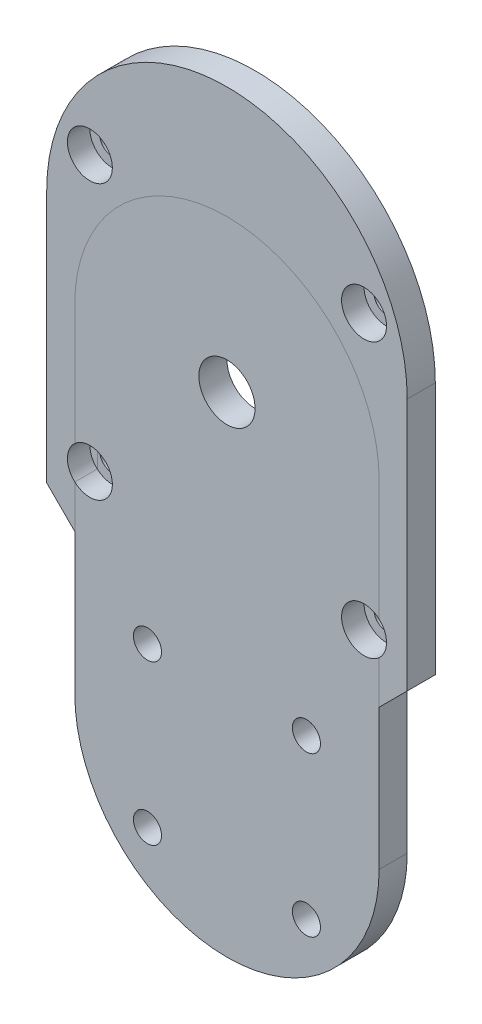
ISO-10303-21;
HEADER;
FILE_DESCRIPTION(('STEP AP214'),'2;1');
FILE_NAME('part.step','',(''),(''),'','','');
FILE_SCHEMA(('AUTOMOTIVE_DESIGN { 1 0 10303 214 1 1 1 1 }'));
ENDSEC;
DATA;
#1=APPLICATION_CONTEXT('core data for automotive mechanical design processes');
#2=APPLICATION_PROTOCOL_DEFINITION('international standard','automotive_design',2000,#1);
#3=PRODUCT_CONTEXT('',#1,'mechanical');
#4=PRODUCT('Part','Part','',(#3));
#5=PRODUCT_RELATED_PRODUCT_CATEGORY('part','',(#4));
#6=PRODUCT_DEFINITION_FORMATION('','',#4);
#7=PRODUCT_DEFINITION_CONTEXT('part definition',#1,'design');
#8=PRODUCT_DEFINITION('design','',#6,#7);
#9=PRODUCT_DEFINITION_SHAPE('','',#8);
#10=(LENGTH_UNIT() NAMED_UNIT(*) SI_UNIT(.MILLI.,.METRE.));
#11=(NAMED_UNIT(*) PLANE_ANGLE_UNIT() SI_UNIT($,.RADIAN.));
#12=(NAMED_UNIT(*) SI_UNIT($,.STERADIAN.) SOLID_ANGLE_UNIT());
#13=UNCERTAINTY_MEASURE_WITH_UNIT(LENGTH_MEASURE(1.E-05),#10,'distance_accuracy_value','');
#14=(GEOMETRIC_REPRESENTATION_CONTEXT(3) GLOBAL_UNCERTAINTY_ASSIGNED_CONTEXT((#13)) GLOBAL_UNIT_ASSIGNED_CONTEXT((#10,
#11,#12)) REPRESENTATION_CONTEXT('',''));
#15=CARTESIAN_POINT('',(0.,0.,0.));
#16=DIRECTION('',(0.,0.,1.));
#17=DIRECTION('',(1.,0.,0.));
#18=AXIS2_PLACEMENT_3D('',#15,#16,#17);
#19=CARTESIAN_POINT('',(0.,60.,5.));
#20=DIRECTION('',(0.,0.,-1.));
#21=DIRECTION('',(-1.,0.,0.));
#22=AXIS2_PLACEMENT_3D('',#19,#20,#21);
#23=PLANE('',#22);
#24=CARTESIAN_POINT('',(-24.3951839509359,84.3951839509359,5.));
#25=DIRECTION('',(0.,0.,1.));
#26=DIRECTION('',(1.,0.,0.));
#27=AXIS2_PLACEMENT_3D('',#24,#25,#26);
#28=CIRCLE('',#27,4.);
#29=CARTESIAN_POINT('',(-20.3951839509359,84.3951839509359,5.));
#30=VERTEX_POINT('',#29);
#31=EDGE_CURVE('E547',#30,#30,#28,.T.);
#32=ORIENTED_EDGE('',*,*,#31,.F.);
#33=EDGE_LOOP('',(#32));
#34=FACE_BOUND('',#33,.T.);
#35=CARTESIAN_POINT('',(24.395183950936,84.3951839509364,5.));
#36=DIRECTION('',(0.,0.,1.));
#37=DIRECTION('',(1.,0.,0.));
#38=AXIS2_PLACEMENT_3D('',#35,#36,#37);
#39=CIRCLE('',#38,4.);
#40=CARTESIAN_POINT('',(28.395183950936,84.3951839509364,5.));
#41=VERTEX_POINT('',#40);
#42=EDGE_CURVE('E173',#41,#41,#39,.T.);
#43=ORIENTED_EDGE('',*,*,#42,.F.);
#44=EDGE_LOOP('',(#43));
#45=FACE_BOUND('',#44,.T.);
#46=DIRECTION('',(0.,-1.,0.));
#47=VECTOR('',#46,1.);
#48=CARTESIAN_POINT('',(27.08,60.,5.));
#49=LINE('',#48,#47);
#50=CARTESIAN_POINT('',(27.08,60.,5.));
#51=VERTEX_POINT('',#50);
#52=CARTESIAN_POINT('',(27.08,38.5699067361583,5.));
#53=VERTEX_POINT('',#52);
#54=EDGE_CURVE('E218',#51,#53,#49,.T.);
#55=ORIENTED_EDGE('',*,*,#54,.T.);
#56=CARTESIAN_POINT('',(24.3951839509364,35.6048160490646,5.));
#57=DIRECTION('',(0.,0.,1.));
#58=DIRECTION('',(1.,0.,0.));
#59=AXIS2_PLACEMENT_3D('',#56,#57,#58);
#60=CIRCLE('',#59,4.);
#61=CARTESIAN_POINT('',(27.08,32.6397253619708,5.));
#62=VERTEX_POINT('',#61);
#63=EDGE_CURVE('E71',#62,#53,#60,.T.);
#64=ORIENTED_EDGE('',*,*,#63,.F.);
#65=CARTESIAN_POINT('',(27.08,25.,5.));
#66=VERTEX_POINT('',#65);
#67=EDGE_CURVE('E217',#62,#66,#49,.T.);
#68=ORIENTED_EDGE('',*,*,#67,.T.);
#69=DIRECTION('',(0.707106781186548,0.707106781186547,0.));
#70=VECTOR('',#69,1.);
#71=CARTESIAN_POINT('',(32.08,30.,5.));
#72=LINE('',#71,#70);
#73=CARTESIAN_POINT('',(32.08,30.,5.));
#74=VERTEX_POINT('',#73);
#75=EDGE_CURVE('E220',#66,#74,#72,.T.);
#76=ORIENTED_EDGE('',*,*,#75,.T.);
#77=DIRECTION('',(0.,1.,0.));
#78=VECTOR('',#77,1.);
#79=CARTESIAN_POINT('',(32.08,30.,5.));
#80=LINE('',#79,#78);
#81=CARTESIAN_POINT('',(32.08,75.,5.));
#82=VERTEX_POINT('',#81);
#83=EDGE_CURVE('E223',#74,#82,#80,.T.);
#84=ORIENTED_EDGE('',*,*,#83,.T.);
#85=CARTESIAN_POINT('',(0.,75.,5.));
#86=DIRECTION('',(0.,0.,1.));
#87=DIRECTION('',(-1.,0.,0.));
#88=AXIS2_PLACEMENT_3D('',#85,#86,#87);
#89=CIRCLE('',#88,32.08);
#90=CARTESIAN_POINT('',(-32.08,75.,5.));
#91=VERTEX_POINT('',#90);
#92=EDGE_CURVE('E226',#82,#91,#89,.T.);
#93=ORIENTED_EDGE('',*,*,#92,.T.);
#94=DIRECTION('',(0.,-1.,0.));
#95=VECTOR('',#94,1.);
#96=CARTESIAN_POINT('',(-32.08,30.,5.));
#97=LINE('',#96,#95);
#98=CARTESIAN_POINT('',(-32.08,30.,5.));
#99=VERTEX_POINT('',#98);
#100=EDGE_CURVE('E186',#91,#99,#97,.T.);
#101=ORIENTED_EDGE('',*,*,#100,.T.);
#102=DIRECTION('',(0.707106781186549,-0.707106781186546,0.));
#103=VECTOR('',#102,1.);
#104=CARTESIAN_POINT('',(-32.08,30.,5.));
#105=LINE('',#104,#103);
#106=CARTESIAN_POINT('',(-27.08,25.,5.));
#107=VERTEX_POINT('',#106);
#108=EDGE_CURVE('E181',#99,#107,#105,.T.);
#109=ORIENTED_EDGE('',*,*,#108,.T.);
#110=DIRECTION('',(0.,1.,0.));
#111=VECTOR('',#110,1.);
#112=CARTESIAN_POINT('',(-27.08,60.,5.));
#113=LINE('',#112,#111);
#114=CARTESIAN_POINT('',(-27.08,32.6397253619714,5.));
#115=VERTEX_POINT('',#114);
#116=EDGE_CURVE('E211',#107,#115,#113,.T.);
#117=ORIENTED_EDGE('',*,*,#116,.T.);
#118=CARTESIAN_POINT('',(-24.3951839509355,35.6048160490644,5.));
#119=DIRECTION('',(0.,0.,1.));
#120=DIRECTION('',(1.,0.,0.));
#121=AXIS2_PLACEMENT_3D('',#118,#119,#120);
#122=CIRCLE('',#121,4.);
#123=CARTESIAN_POINT('',(-27.08,38.5699067361574,5.));
#124=VERTEX_POINT('',#123);
#125=EDGE_CURVE('E79',#124,#115,#122,.T.);
#126=ORIENTED_EDGE('',*,*,#125,.F.);
#127=CARTESIAN_POINT('',(-27.08,60.,5.));
#128=VERTEX_POINT('',#127);
#129=EDGE_CURVE('E210',#124,#128,#113,.T.);
#130=ORIENTED_EDGE('',*,*,#129,.T.);
#131=CARTESIAN_POINT('',(0.,60.,5.));
#132=DIRECTION('',(0.,0.,-1.));
#133=DIRECTION('',(-1.,0.,0.));
#134=AXIS2_PLACEMENT_3D('',#131,#132,#133);
#135=CIRCLE('',#134,27.08);
#136=EDGE_CURVE('E214',#128,#51,#135,.T.);
#137=ORIENTED_EDGE('',*,*,#136,.T.);
#138=EDGE_LOOP('',(#55,#64,#68,#76,#84,#93,#101,#109,#117,#126,#130,#137));
#139=FACE_BOUND('',#138,.T.);
#140=ADVANCED_FACE('F55',(#34,#45,#139),#23,.F.);
#141=CARTESIAN_POINT('',(-32.08,30.,0.));
#142=DIRECTION('',(-0.707106781186546,-0.707106781186549,0.));
#143=DIRECTION('',(0.707106781186549,-0.707106781186546,0.));
#144=AXIS2_PLACEMENT_3D('',#141,#142,#143);
#145=PLANE('',#144);
#146=ORIENTED_EDGE('',*,*,#108,.F.);
#147=DIRECTION('',(0.,0.,1.));
#148=VECTOR('',#147,1.);
#149=CARTESIAN_POINT('',(-32.08,30.,0.));
#150=LINE('',#149,#148);
#151=CARTESIAN_POINT('',(-32.08,30.,0.));
#152=VERTEX_POINT('',#151);
#153=EDGE_CURVE('E231',#152,#99,#150,.T.);
#154=ORIENTED_EDGE('',*,*,#153,.F.);
#155=DIRECTION('',(0.707106781186549,-0.707106781186546,0.));
#156=VECTOR('',#155,1.);
#157=CARTESIAN_POINT('',(-32.08,30.,0.));
#158=LINE('',#157,#156);
#159=CARTESIAN_POINT('',(-27.08,25.,0.));
#160=VERTEX_POINT('',#159);
#161=EDGE_CURVE('E182',#152,#160,#158,.T.);
#162=ORIENTED_EDGE('',*,*,#161,.T.);
#163=DIRECTION('',(0.,0.,1.));
#164=VECTOR('',#163,1.);
#165=CARTESIAN_POINT('',(-27.08,25.,0.));
#166=LINE('',#165,#164);
#167=EDGE_CURVE('E207',#160,#107,#166,.T.);
#168=ORIENTED_EDGE('',*,*,#167,.T.);
#169=EDGE_LOOP('',(#146,#154,#162,#168));
#170=FACE_BOUND('',#169,.T.);
#171=ADVANCED_FACE('F57',(#170),#145,.T.);
#172=CARTESIAN_POINT('',(-32.08,30.,0.));
#173=DIRECTION('',(-1.,0.,0.));
#174=DIRECTION('',(0.,0.,1.));
#175=AXIS2_PLACEMENT_3D('',#172,#173,#174);
#176=PLANE('',#175);
#177=ORIENTED_EDGE('',*,*,#100,.F.);
#178=DIRECTION('',(0.,0.,1.));
#179=VECTOR('',#178,1.);
#180=CARTESIAN_POINT('',(-32.08,75.,0.));
#181=LINE('',#180,#179);
#182=CARTESIAN_POINT('',(-32.08,75.,0.));
#183=VERTEX_POINT('',#182);
#184=EDGE_CURVE('E234',#183,#91,#181,.T.);
#185=ORIENTED_EDGE('',*,*,#184,.F.);
#186=DIRECTION('',(0.,-1.,0.));
#187=VECTOR('',#186,1.);
#188=CARTESIAN_POINT('',(-32.08,30.,0.));
#189=LINE('',#188,#187);
#190=EDGE_CURVE('E204',#183,#152,#189,.T.);
#191=ORIENTED_EDGE('',*,*,#190,.T.);
#192=ORIENTED_EDGE('',*,*,#153,.T.);
#193=EDGE_LOOP('',(#177,#185,#191,#192));
#194=FACE_BOUND('',#193,.T.);
#195=ADVANCED_FACE('F284',(#194),#176,.T.);
#196=CARTESIAN_POINT('',(0.,75.,0.));
#197=DIRECTION('',(0.,0.,1.));
#198=DIRECTION('',(1.,0.,0.));
#199=AXIS2_PLACEMENT_3D('',#196,#197,#198);
#200=CYLINDRICAL_SURFACE('',#199,32.08);
#201=ORIENTED_EDGE('',*,*,#92,.F.);
#202=DIRECTION('',(0.,0.,1.));
#203=VECTOR('',#202,1.);
#204=CARTESIAN_POINT('',(32.08,75.,0.));
#205=LINE('',#204,#203);
#206=CARTESIAN_POINT('',(32.08,75.,0.));
#207=VERTEX_POINT('',#206);
#208=EDGE_CURVE('E236',#207,#82,#205,.T.);
#209=ORIENTED_EDGE('',*,*,#208,.F.);
#210=CARTESIAN_POINT('',(0.,75.,0.));
#211=DIRECTION('',(0.,0.,1.));
#212=DIRECTION('',(-1.,0.,0.));
#213=AXIS2_PLACEMENT_3D('',#210,#211,#212);
#214=CIRCLE('',#213,32.08);
#215=EDGE_CURVE('E201',#207,#183,#214,.T.);
#216=ORIENTED_EDGE('',*,*,#215,.T.);
#217=ORIENTED_EDGE('',*,*,#184,.T.);
#218=EDGE_LOOP('',(#201,#209,#216,#217));
#219=FACE_BOUND('',#218,.T.);
#220=ADVANCED_FACE('F281',(#219),#200,.T.);
#221=CARTESIAN_POINT('',(32.08,30.,0.));
#222=DIRECTION('',(1.,0.,0.));
#223=DIRECTION('',(0.,0.,-1.));
#224=AXIS2_PLACEMENT_3D('',#221,#222,#223);
#225=PLANE('',#224);
#226=ORIENTED_EDGE('',*,*,#83,.F.);
#227=DIRECTION('',(0.,0.,1.));
#228=VECTOR('',#227,1.);
#229=CARTESIAN_POINT('',(32.08,30.,0.));
#230=LINE('',#229,#228);
#231=CARTESIAN_POINT('',(32.08,30.,0.));
#232=VERTEX_POINT('',#231);
#233=EDGE_CURVE('E238',#232,#74,#230,.T.);
#234=ORIENTED_EDGE('',*,*,#233,.F.);
#235=DIRECTION('',(0.,1.,0.));
#236=VECTOR('',#235,1.);
#237=CARTESIAN_POINT('',(32.08,30.,0.));
#238=LINE('',#237,#236);
#239=EDGE_CURVE('E198',#232,#207,#238,.T.);
#240=ORIENTED_EDGE('',*,*,#239,.T.);
#241=ORIENTED_EDGE('',*,*,#208,.T.);
#242=EDGE_LOOP('',(#226,#234,#240,#241));
#243=FACE_BOUND('',#242,.T.);
#244=ADVANCED_FACE('F279',(#243),#225,.T.);
#245=CARTESIAN_POINT('',(32.08,30.,0.));
#246=DIRECTION('',(0.707106781186547,-0.707106781186548,0.));
#247=DIRECTION('',(0.707106781186548,0.707106781186547,0.));
#248=AXIS2_PLACEMENT_3D('',#245,#246,#247);
#249=PLANE('',#248);
#250=ORIENTED_EDGE('',*,*,#75,.F.);
#251=DIRECTION('',(0.,0.,1.));
#252=VECTOR('',#251,1.);
#253=CARTESIAN_POINT('',(27.08,25.,0.));
#254=LINE('',#253,#252);
#255=CARTESIAN_POINT('',(27.08,25.,0.));
#256=VERTEX_POINT('',#255);
#257=EDGE_CURVE('E240',#256,#66,#254,.T.);
#258=ORIENTED_EDGE('',*,*,#257,.F.);
#259=DIRECTION('',(0.707106781186548,0.707106781186547,0.));
#260=VECTOR('',#259,1.);
#261=CARTESIAN_POINT('',(32.08,30.,0.));
#262=LINE('',#261,#260);
#263=EDGE_CURVE('E195',#256,#232,#262,.T.);
#264=ORIENTED_EDGE('',*,*,#263,.T.);
#265=ORIENTED_EDGE('',*,*,#233,.T.);
#266=EDGE_LOOP('',(#250,#258,#264,#265));
#267=FACE_BOUND('',#266,.T.);
#268=ADVANCED_FACE('F274',(#267),#249,.T.);
#269=CARTESIAN_POINT('',(27.08,60.,0.));
#270=DIRECTION('',(-1.,0.,0.));
#271=DIRECTION('',(0.,-1.,0.));
#272=AXIS2_PLACEMENT_3D('',#269,#270,#271);
#273=PLANE('',#272);
#274=DIRECTION('',(0.,0.,1.));
#275=VECTOR('',#274,1.);
#276=CARTESIAN_POINT('',(27.08,32.6397253619708,5.));
#277=LINE('',#276,#275);
#278=CARTESIAN_POINT('',(27.08,32.6397253619708,1.));
#279=VERTEX_POINT('',#278);
#280=EDGE_CURVE('E12',#279,#62,#277,.T.);
#281=ORIENTED_EDGE('',*,*,#280,.F.);
#282=DIRECTION('',(0.,-1.,0.));
#283=VECTOR('',#282,1.);
#284=CARTESIAN_POINT('',(27.08,60.,1.));
#285=LINE('',#284,#283);
#286=CARTESIAN_POINT('',(27.08,38.5699067361583,1.));
#287=VERTEX_POINT('',#286);
#288=EDGE_CURVE('E64',#287,#279,#285,.T.);
#289=ORIENTED_EDGE('',*,*,#288,.F.);
#290=DIRECTION('',(0.,0.,1.));
#291=VECTOR('',#290,1.);
#292=CARTESIAN_POINT('',(27.08,38.5699067361583,5.));
#293=LINE('',#292,#291);
#294=EDGE_CURVE('E143',#53,#287,#293,.F.);
#295=ORIENTED_EDGE('',*,*,#294,.F.);
#296=ORIENTED_EDGE('',*,*,#54,.F.);
#297=DIRECTION('',(0.,0.,1.));
#298=VECTOR('',#297,1.);
#299=CARTESIAN_POINT('',(27.08,60.,0.));
#300=LINE('',#299,#298);
#301=CARTESIAN_POINT('',(27.08,60.,0.));
#302=VERTEX_POINT('',#301);
#303=EDGE_CURVE('E243',#302,#51,#300,.T.);
#304=ORIENTED_EDGE('',*,*,#303,.F.);
#305=DIRECTION('',(0.,-1.,0.));
#306=VECTOR('',#305,1.);
#307=CARTESIAN_POINT('',(27.08,60.,0.));
#308=LINE('',#307,#306);
#309=EDGE_CURVE('E192',#302,#256,#308,.T.);
#310=ORIENTED_EDGE('',*,*,#309,.T.);
#311=ORIENTED_EDGE('',*,*,#257,.T.);
#312=ORIENTED_EDGE('',*,*,#67,.F.);
#313=EDGE_LOOP('',(#281,#289,#295,#296,#304,#310,#311,#312));
#314=FACE_BOUND('',#313,.T.);
#315=ADVANCED_FACE('F157',(#314),#273,.T.);
#316=CARTESIAN_POINT('',(0.,60.,0.));
#317=DIRECTION('',(0.,0.,1.));
#318=DIRECTION('',(1.,0.,0.));
#319=AXIS2_PLACEMENT_3D('',#316,#317,#318);
#320=CYLINDRICAL_SURFACE('',#319,27.08);
#321=ORIENTED_EDGE('',*,*,#136,.F.);
#322=DIRECTION('',(0.,0.,1.));
#323=VECTOR('',#322,1.);
#324=CARTESIAN_POINT('',(-27.08,60.,0.));
#325=LINE('',#324,#323);
#326=CARTESIAN_POINT('',(-27.08,60.,0.));
#327=VERTEX_POINT('',#326);
#328=EDGE_CURVE('E245',#327,#128,#325,.T.);
#329=ORIENTED_EDGE('',*,*,#328,.F.);
#330=CARTESIAN_POINT('',(0.,60.,0.));
#331=DIRECTION('',(0.,0.,-1.));
#332=DIRECTION('',(-1.,0.,0.));
#333=AXIS2_PLACEMENT_3D('',#330,#331,#332);
#334=CIRCLE('',#333,27.08);
#335=EDGE_CURVE('E189',#327,#302,#334,.T.);
#336=ORIENTED_EDGE('',*,*,#335,.T.);
#337=ORIENTED_EDGE('',*,*,#303,.T.);
#338=EDGE_LOOP('',(#321,#329,#336,#337));
#339=FACE_BOUND('',#338,.T.);
#340=ADVANCED_FACE('F264',(#339),#320,.F.);
#341=CARTESIAN_POINT('',(-27.08,60.,0.));
#342=DIRECTION('',(1.,0.,0.));
#343=DIRECTION('',(0.,0.,-1.));
#344=AXIS2_PLACEMENT_3D('',#341,#342,#343);
#345=PLANE('',#344);
#346=DIRECTION('',(0.,0.,1.));
#347=VECTOR('',#346,1.);
#348=CARTESIAN_POINT('',(-27.08,38.5699067361574,5.));
#349=LINE('',#348,#347);
#350=CARTESIAN_POINT('',(-27.08,38.5699067361574,1.));
#351=VERTEX_POINT('',#350);
#352=EDGE_CURVE('E152',#351,#124,#349,.T.);
#353=ORIENTED_EDGE('',*,*,#352,.F.);
#354=DIRECTION('',(0.,1.,0.));
#355=VECTOR('',#354,1.);
#356=CARTESIAN_POINT('',(-27.08,60.,1.));
#357=LINE('',#356,#355);
#358=CARTESIAN_POINT('',(-27.08,32.6397253619714,1.));
#359=VERTEX_POINT('',#358);
#360=EDGE_CURVE('E250',#359,#351,#357,.T.);
#361=ORIENTED_EDGE('',*,*,#360,.F.);
#362=DIRECTION('',(0.,0.,1.));
#363=VECTOR('',#362,1.);
#364=CARTESIAN_POINT('',(-27.08,32.6397253619714,5.));
#365=LINE('',#364,#363);
#366=EDGE_CURVE('E233',#115,#359,#365,.F.);
#367=ORIENTED_EDGE('',*,*,#366,.F.);
#368=ORIENTED_EDGE('',*,*,#116,.F.);
#369=ORIENTED_EDGE('',*,*,#167,.F.);
#370=DIRECTION('',(0.,1.,0.));
#371=VECTOR('',#370,1.);
#372=CARTESIAN_POINT('',(-27.08,60.,0.));
#373=LINE('',#372,#371);
#374=EDGE_CURVE('E185',#160,#327,#373,.T.);
#375=ORIENTED_EDGE('',*,*,#374,.T.);
#376=ORIENTED_EDGE('',*,*,#328,.T.);
#377=ORIENTED_EDGE('',*,*,#129,.F.);
#378=EDGE_LOOP('',(#353,#361,#367,#368,#369,#375,#376,#377));
#379=FACE_BOUND('',#378,.T.);
#380=ADVANCED_FACE('F259',(#379),#345,.T.);
#381=CARTESIAN_POINT('',(0.,60.,0.));
#382=DIRECTION('',(0.,0.,-1.));
#383=DIRECTION('',(-1.,0.,0.));
#384=AXIS2_PLACEMENT_3D('',#381,#382,#383);
#385=PLANE('',#384);
#386=CARTESIAN_POINT('',(-24.3951839509359,84.3951839509359,0.));
#387=DIRECTION('',(0.,0.,-1.));
#388=DIRECTION('',(-1.,0.,0.));
#389=AXIS2_PLACEMENT_3D('',#386,#387,#388);
#390=CIRCLE('',#389,2.25);
#391=CARTESIAN_POINT('',(-26.6451839509359,84.3951839509359,0.));
#392=VERTEX_POINT('',#391);
#393=EDGE_CURVE('E59',#392,#392,#390,.T.);
#394=ORIENTED_EDGE('',*,*,#393,.F.);
#395=EDGE_LOOP('',(#394));
#396=FACE_BOUND('',#395,.T.);
#397=CARTESIAN_POINT('',(24.395183950936,84.3951839509364,0.));
#398=DIRECTION('',(0.,0.,-1.));
#399=DIRECTION('',(-1.,0.,0.));
#400=AXIS2_PLACEMENT_3D('',#397,#398,#399);
#401=CIRCLE('',#400,2.25);
#402=CARTESIAN_POINT('',(22.145183950936,84.3951839509364,0.));
#403=VERTEX_POINT('',#402);
#404=EDGE_CURVE('E161',#403,#403,#401,.T.);
#405=ORIENTED_EDGE('',*,*,#404,.F.);
#406=EDGE_LOOP('',(#405));
#407=FACE_BOUND('',#406,.T.);
#408=ORIENTED_EDGE('',*,*,#161,.F.);
#409=ORIENTED_EDGE('',*,*,#190,.F.);
#410=ORIENTED_EDGE('',*,*,#215,.F.);
#411=ORIENTED_EDGE('',*,*,#239,.F.);
#412=ORIENTED_EDGE('',*,*,#263,.F.);
#413=ORIENTED_EDGE('',*,*,#309,.F.);
#414=ORIENTED_EDGE('',*,*,#335,.F.);
#415=ORIENTED_EDGE('',*,*,#374,.F.);
#416=EDGE_LOOP('',(#408,#409,#410,#411,#412,#413,#414,#415));
#417=FACE_BOUND('',#416,.T.);
#418=ADVANCED_FACE('F269',(#396,#407,#417),#385,.T.);
#419=CARTESIAN_POINT('',(-22.1451839509355,35.6048160490644,1.));
#420=DIRECTION('',(0.,0.,-1.));
#421=DIRECTION('',(-1.,0.,0.));
#422=AXIS2_PLACEMENT_3D('',#419,#420,#421);
#423=PLANE('',#422);
#424=ORIENTED_EDGE('',*,*,#360,.T.);
#425=CARTESIAN_POINT('',(-24.3951839509355,35.6048160490644,1.));
#426=DIRECTION('',(0.,0.,1.));
#427=DIRECTION('',(1.,0.,0.));
#428=AXIS2_PLACEMENT_3D('',#425,#426,#427);
#429=CIRCLE('',#428,4.);
#430=EDGE_CURVE('E178',#351,#359,#429,.T.);
#431=ORIENTED_EDGE('',*,*,#430,.T.);
#432=EDGE_LOOP('',(#424,#431));
#433=FACE_BOUND('',#432,.T.);
#434=ADVANCED_FACE('F288',(#433),#423,.F.);
#435=CARTESIAN_POINT('',(-24.3951839509355,35.6048160490644,5.));
#436=DIRECTION('',(0.,0.,1.));
#437=DIRECTION('',(1.,0.,0.));
#438=AXIS2_PLACEMENT_3D('',#435,#436,#437);
#439=CYLINDRICAL_SURFACE('',#438,4.);
#440=ORIENTED_EDGE('',*,*,#352,.T.);
#441=ORIENTED_EDGE('',*,*,#125,.T.);
#442=ORIENTED_EDGE('',*,*,#366,.T.);
#443=ORIENTED_EDGE('',*,*,#430,.F.);
#444=EDGE_LOOP('',(#440,#441,#442,#443));
#445=FACE_BOUND('',#444,.T.);
#446=ADVANCED_FACE('F253',(#445),#439,.F.);
#447=CARTESIAN_POINT('',(26.6451839509363,35.6048160490646,1.));
#448=DIRECTION('',(0.,0.,-1.));
#449=DIRECTION('',(-1.,0.,0.));
#450=AXIS2_PLACEMENT_3D('',#447,#448,#449);
#451=PLANE('',#450);
#452=ORIENTED_EDGE('',*,*,#288,.T.);
#453=CARTESIAN_POINT('',(24.3951839509364,35.6048160490646,1.));
#454=DIRECTION('',(0.,0.,1.));
#455=DIRECTION('',(1.,0.,0.));
#456=AXIS2_PLACEMENT_3D('',#453,#454,#455);
#457=CIRCLE('',#456,4.);
#458=EDGE_CURVE('E146',#279,#287,#457,.T.);
#459=ORIENTED_EDGE('',*,*,#458,.T.);
#460=EDGE_LOOP('',(#452,#459));
#461=FACE_BOUND('',#460,.T.);
#462=ADVANCED_FACE('F155',(#461),#451,.F.);
#463=CARTESIAN_POINT('',(24.3951839509364,35.6048160490646,5.));
#464=DIRECTION('',(0.,0.,1.));
#465=DIRECTION('',(1.,0.,0.));
#466=AXIS2_PLACEMENT_3D('',#463,#464,#465);
#467=CYLINDRICAL_SURFACE('',#466,4.);
#468=ORIENTED_EDGE('',*,*,#280,.T.);
#469=ORIENTED_EDGE('',*,*,#63,.T.);
#470=ORIENTED_EDGE('',*,*,#294,.T.);
#471=ORIENTED_EDGE('',*,*,#458,.F.);
#472=EDGE_LOOP('',(#468,#469,#470,#471));
#473=FACE_BOUND('',#472,.T.);
#474=ADVANCED_FACE('F145',(#473),#467,.F.);
#475=CARTESIAN_POINT('',(24.395183950936,84.3951839509364,5.));
#476=DIRECTION('',(0.,0.,1.));
#477=DIRECTION('',(1.,0.,0.));
#478=AXIS2_PLACEMENT_3D('',#475,#476,#477);
#479=CYLINDRICAL_SURFACE('',#478,2.25);
#480=ORIENTED_EDGE('',*,*,#404,.T.);
#481=EDGE_LOOP('',(#480));
#482=FACE_BOUND('',#481,.T.);
#483=CARTESIAN_POINT('',(24.395183950936,84.3951839509364,1.));
#484=DIRECTION('',(0.,0.,1.));
#485=DIRECTION('',(1.,0.,0.));
#486=AXIS2_PLACEMENT_3D('',#483,#484,#485);
#487=CIRCLE('',#486,2.25);
#488=CARTESIAN_POINT('',(26.645183950936,84.3951839509364,1.));
#489=VERTEX_POINT('',#488);
#490=EDGE_CURVE('E163',#489,#489,#487,.T.);
#491=ORIENTED_EDGE('',*,*,#490,.T.);
#492=EDGE_LOOP('',(#491));
#493=FACE_BOUND('',#492,.T.);
#494=ADVANCED_FACE('F354',(#482,#493),#479,.F.);
#495=CARTESIAN_POINT('',(26.645183950936,84.3951839509364,1.));
#496=DIRECTION('',(0.,0.,-1.));
#497=DIRECTION('',(-1.,0.,0.));
#498=AXIS2_PLACEMENT_3D('',#495,#496,#497);
#499=PLANE('',#498);
#500=ORIENTED_EDGE('',*,*,#490,.F.);
#501=EDGE_LOOP('',(#500));
#502=FACE_BOUND('',#501,.T.);
#503=CARTESIAN_POINT('',(24.395183950936,84.3951839509364,1.));
#504=DIRECTION('',(0.,0.,1.));
#505=DIRECTION('',(1.,0.,0.));
#506=AXIS2_PLACEMENT_3D('',#503,#504,#505);
#507=CIRCLE('',#506,4.);
#508=CARTESIAN_POINT('',(28.395183950936,84.3951839509364,1.));
#509=VERTEX_POINT('',#508);
#510=EDGE_CURVE('E168',#509,#509,#507,.T.);
#511=ORIENTED_EDGE('',*,*,#510,.T.);
#512=EDGE_LOOP('',(#511));
#513=FACE_BOUND('',#512,.T.);
#514=ADVANCED_FACE('F363',(#502,#513),#499,.F.);
#515=CARTESIAN_POINT('',(24.395183950936,84.3951839509364,5.));
#516=DIRECTION('',(0.,0.,1.));
#517=DIRECTION('',(1.,0.,0.));
#518=AXIS2_PLACEMENT_3D('',#515,#516,#517);
#519=CYLINDRICAL_SURFACE('',#518,4.);
#520=ORIENTED_EDGE('',*,*,#510,.F.);
#521=EDGE_LOOP('',(#520));
#522=FACE_BOUND('',#521,.T.);
#523=ORIENTED_EDGE('',*,*,#42,.T.);
#524=EDGE_LOOP('',(#523));
#525=FACE_BOUND('',#524,.T.);
#526=ADVANCED_FACE('F372',(#522,#525),#519,.F.);
#527=CARTESIAN_POINT('',(-24.3951839509359,84.3951839509359,5.));
#528=DIRECTION('',(0.,0.,1.));
#529=DIRECTION('',(1.,0.,0.));
#530=AXIS2_PLACEMENT_3D('',#527,#528,#529);
#531=CYLINDRICAL_SURFACE('',#530,2.25);
#532=ORIENTED_EDGE('',*,*,#393,.T.);
#533=EDGE_LOOP('',(#532));
#534=FACE_BOUND('',#533,.T.);
#535=CARTESIAN_POINT('',(-24.3951839509359,84.3951839509359,1.));
#536=DIRECTION('',(0.,0.,1.));
#537=DIRECTION('',(1.,0.,0.));
#538=AXIS2_PLACEMENT_3D('',#535,#536,#537);
#539=CIRCLE('',#538,2.25);
#540=CARTESIAN_POINT('',(-22.1451839509359,84.3951839509359,1.));
#541=VERTEX_POINT('',#540);
#542=EDGE_CURVE('E549',#541,#541,#539,.T.);
#543=ORIENTED_EDGE('',*,*,#542,.T.);
#544=EDGE_LOOP('',(#543));
#545=FACE_BOUND('',#544,.T.);
#546=ADVANCED_FACE('F382',(#534,#545),#531,.F.);
#547=CARTESIAN_POINT('',(-22.1451839509359,84.3951839509359,1.));
#548=DIRECTION('',(0.,0.,-1.));
#549=DIRECTION('',(-1.,0.,0.));
#550=AXIS2_PLACEMENT_3D('',#547,#548,#549);
#551=PLANE('',#550);
#552=ORIENTED_EDGE('',*,*,#542,.F.);
#553=EDGE_LOOP('',(#552));
#554=FACE_BOUND('',#553,.T.);
#555=CARTESIAN_POINT('',(-24.3951839509359,84.3951839509359,1.));
#556=DIRECTION('',(0.,0.,1.));
#557=DIRECTION('',(1.,0.,0.));
#558=AXIS2_PLACEMENT_3D('',#555,#556,#557);
#559=CIRCLE('',#558,4.);
#560=CARTESIAN_POINT('',(-20.3951839509359,84.3951839509359,1.));
#561=VERTEX_POINT('',#560);
#562=EDGE_CURVE('E545',#561,#561,#559,.T.);
#563=ORIENTED_EDGE('',*,*,#562,.T.);
#564=EDGE_LOOP('',(#563));
#565=FACE_BOUND('',#564,.T.);
#566=ADVANCED_FACE('F392',(#554,#565),#551,.F.);
#567=CARTESIAN_POINT('',(-24.3951839509359,84.3951839509359,5.));
#568=DIRECTION('',(0.,0.,1.));
#569=DIRECTION('',(1.,0.,0.));
#570=AXIS2_PLACEMENT_3D('',#567,#568,#569);
#571=CYLINDRICAL_SURFACE('',#570,4.);
#572=ORIENTED_EDGE('',*,*,#562,.F.);
#573=EDGE_LOOP('',(#572));
#574=FACE_BOUND('',#573,.T.);
#575=ORIENTED_EDGE('',*,*,#31,.T.);
#576=EDGE_LOOP('',(#575));
#577=FACE_BOUND('',#576,.T.);
#578=ADVANCED_FACE('F402',(#574,#577),#571,.F.);
#579=CLOSED_SHELL('',(#140,#171,#195,#220,#244,#268,#315,#340,#380,#418,#434,#446,#462,#474,
#494,#514,#526,#546,#566,#578));
#580=MANIFOLD_SOLID_BREP('B2',#579);
#581=CARTESIAN_POINT('',(0.,0.,5.));
#582=DIRECTION('',(0.,0.,-1.));
#583=DIRECTION('',(-1.,0.,0.));
#584=AXIS2_PLACEMENT_3D('',#581,#582,#583);
#585=CYLINDRICAL_SURFACE('',#584,27.08);
#586=CARTESIAN_POINT('',(0.,0.,0.));
#587=DIRECTION('',(0.,0.,1.));
#588=DIRECTION('',(1.,0.,0.));
#589=AXIS2_PLACEMENT_3D('',#586,#587,#588);
#590=CIRCLE('',#589,27.08);
#591=CARTESIAN_POINT('',(-27.08,0.,0.));
#592=VERTEX_POINT('',#591);
#593=CARTESIAN_POINT('',(27.08,0.,0.));
#594=VERTEX_POINT('',#593);
#595=EDGE_CURVE('E702',#592,#594,#590,.T.);
#596=ORIENTED_EDGE('',*,*,#595,.T.);
#597=DIRECTION('',(0.,0.,-1.));
#598=VECTOR('',#597,1.);
#599=CARTESIAN_POINT('',(27.08,0.,5.));
#600=LINE('',#599,#598);
#601=CARTESIAN_POINT('',(27.08,0.,5.));
#602=VERTEX_POINT('',#601);
#603=EDGE_CURVE('E746',#602,#594,#600,.T.);
#604=ORIENTED_EDGE('',*,*,#603,.F.);
#605=CARTESIAN_POINT('',(0.,0.,5.));
#606=DIRECTION('',(0.,0.,1.));
#607=DIRECTION('',(1.,0.,0.));
#608=AXIS2_PLACEMENT_3D('',#605,#606,#607);
#609=CIRCLE('',#608,27.08);
#610=CARTESIAN_POINT('',(-27.08,0.,5.));
#611=VERTEX_POINT('',#610);
#612=EDGE_CURVE('E706',#611,#602,#609,.T.);
#613=ORIENTED_EDGE('',*,*,#612,.F.);
#614=DIRECTION('',(0.,0.,-1.));
#615=VECTOR('',#614,1.);
#616=CARTESIAN_POINT('',(-27.08,0.,5.));
#617=LINE('',#616,#615);
#618=EDGE_CURVE('E723',#611,#592,#617,.T.);
#619=ORIENTED_EDGE('',*,*,#618,.T.);
#620=EDGE_LOOP('',(#596,#604,#613,#619));
#621=FACE_BOUND('',#620,.T.);
#622=ADVANCED_FACE('F567',(#621),#585,.T.);
#623=CARTESIAN_POINT('',(27.08,60.,5.));
#624=DIRECTION('',(-1.,0.,0.));
#625=DIRECTION('',(0.,-1.,0.));
#626=AXIS2_PLACEMENT_3D('',#623,#624,#625);
#627=PLANE('',#626);
#628=DIRECTION('',(0.,-1.,0.));
#629=VECTOR('',#628,1.);
#630=CARTESIAN_POINT('',(27.08,60.,1.));
#631=LINE('',#630,#629);
#632=CARTESIAN_POINT('',(27.08,38.5699067361583,1.));
#633=VERTEX_POINT('',#632);
#634=CARTESIAN_POINT('',(27.08,32.6397253619708,1.));
#635=VERTEX_POINT('',#634);
#636=EDGE_CURVE('E53',#633,#635,#631,.T.);
#637=ORIENTED_EDGE('',*,*,#636,.T.);
#638=DIRECTION('',(0.,0.,1.));
#639=VECTOR('',#638,1.);
#640=CARTESIAN_POINT('',(27.08,32.6397253619708,5.));
#641=LINE('',#640,#639);
#642=CARTESIAN_POINT('',(27.08,32.6397253619708,5.));
#643=VERTEX_POINT('',#642);
#644=EDGE_CURVE('E637',#635,#643,#641,.T.);
#645=ORIENTED_EDGE('',*,*,#644,.T.);
#646=DIRECTION('',(0.,1.,0.));
#647=VECTOR('',#646,1.);
#648=CARTESIAN_POINT('',(27.08,60.,5.));
#649=LINE('',#648,#647);
#650=EDGE_CURVE('E711',#602,#643,#649,.T.);
#651=ORIENTED_EDGE('',*,*,#650,.F.);
#652=ORIENTED_EDGE('',*,*,#603,.T.);
#653=DIRECTION('',(0.,1.,0.));
#654=VECTOR('',#653,1.);
#655=CARTESIAN_POINT('',(27.08,60.,0.));
#656=LINE('',#655,#654);
#657=CARTESIAN_POINT('',(27.08,60.,0.));
#658=VERTEX_POINT('',#657);
#659=EDGE_CURVE('E727',#594,#658,#656,.T.);
#660=ORIENTED_EDGE('',*,*,#659,.T.);
#661=DIRECTION('',(0.,0.,-1.));
#662=VECTOR('',#661,1.);
#663=CARTESIAN_POINT('',(27.08,60.,5.));
#664=LINE('',#663,#662);
#665=CARTESIAN_POINT('',(27.08,60.,5.));
#666=VERTEX_POINT('',#665);
#667=EDGE_CURVE('E742',#666,#658,#664,.T.);
#668=ORIENTED_EDGE('',*,*,#667,.F.);
#669=CARTESIAN_POINT('',(27.08,38.5699067361583,5.));
#670=VERTEX_POINT('',#669);
#671=EDGE_CURVE('E645',#670,#666,#649,.T.);
#672=ORIENTED_EDGE('',*,*,#671,.F.);
#673=DIRECTION('',(0.,0.,1.));
#674=VECTOR('',#673,1.);
#675=CARTESIAN_POINT('',(27.08,38.5699067361583,5.));
#676=LINE('',#675,#674);
#677=EDGE_CURVE('E582',#670,#633,#676,.F.);
#678=ORIENTED_EDGE('',*,*,#677,.T.);
#679=EDGE_LOOP('',(#637,#645,#651,#652,#660,#668,#672,#678));
#680=FACE_BOUND('',#679,.T.);
#681=ADVANCED_FACE('F643',(#680),#627,.F.);
#682=CARTESIAN_POINT('',(0.,60.,5.));
#683=DIRECTION('',(0.,0.,-1.));
#684=DIRECTION('',(-1.,0.,0.));
#685=AXIS2_PLACEMENT_3D('',#682,#683,#684);
#686=CYLINDRICAL_SURFACE('',#685,27.08);
#687=CARTESIAN_POINT('',(0.,60.,0.));
#688=DIRECTION('',(0.,0.,1.));
#689=DIRECTION('',(-1.,0.,0.));
#690=AXIS2_PLACEMENT_3D('',#687,#688,#689);
#691=CIRCLE('',#690,27.08);
#692=CARTESIAN_POINT('',(-27.08,60.,0.));
#693=VERTEX_POINT('',#692);
#694=EDGE_CURVE('E730',#658,#693,#691,.T.);
#695=ORIENTED_EDGE('',*,*,#694,.T.);
#696=DIRECTION('',(0.,0.,-1.));
#697=VECTOR('',#696,1.);
#698=CARTESIAN_POINT('',(-27.08,60.,5.));
#699=LINE('',#698,#697);
#700=CARTESIAN_POINT('',(-27.08,60.,5.));
#701=VERTEX_POINT('',#700);
#702=EDGE_CURVE('E738',#701,#693,#699,.T.);
#703=ORIENTED_EDGE('',*,*,#702,.F.);
#704=CARTESIAN_POINT('',(0.,60.,5.));
#705=DIRECTION('',(0.,0.,1.));
#706=DIRECTION('',(-1.,0.,0.));
#707=AXIS2_PLACEMENT_3D('',#704,#705,#706);
#708=CIRCLE('',#707,27.08);
#709=EDGE_CURVE('E715',#666,#701,#708,.T.);
#710=ORIENTED_EDGE('',*,*,#709,.F.);
#711=ORIENTED_EDGE('',*,*,#667,.T.);
#712=EDGE_LOOP('',(#695,#703,#710,#711));
#713=FACE_BOUND('',#712,.T.);
#714=ADVANCED_FACE('F775',(#713),#686,.T.);
#715=CARTESIAN_POINT('',(-27.08,0.,5.));
#716=DIRECTION('',(1.,0.,0.));
#717=DIRECTION('',(0.,1.,0.));
#718=AXIS2_PLACEMENT_3D('',#715,#716,#717);
#719=PLANE('',#718);
#720=DIRECTION('',(0.,1.,0.));
#721=VECTOR('',#720,1.);
#722=CARTESIAN_POINT('',(-27.08,0.,1.));
#723=LINE('',#722,#721);
#724=CARTESIAN_POINT('',(-27.08,32.6397253619714,1.));
#725=VERTEX_POINT('',#724);
#726=CARTESIAN_POINT('',(-27.08,38.5699067361574,1.));
#727=VERTEX_POINT('',#726);
#728=EDGE_CURVE('E750',#725,#727,#723,.T.);
#729=ORIENTED_EDGE('',*,*,#728,.T.);
#730=DIRECTION('',(0.,0.,1.));
#731=VECTOR('',#730,1.);
#732=CARTESIAN_POINT('',(-27.08,38.5699067361574,5.));
#733=LINE('',#732,#731);
#734=CARTESIAN_POINT('',(-27.08,38.5699067361574,5.));
#735=VERTEX_POINT('',#734);
#736=EDGE_CURVE('E657',#727,#735,#733,.T.);
#737=ORIENTED_EDGE('',*,*,#736,.T.);
#738=DIRECTION('',(0.,-1.,0.));
#739=VECTOR('',#738,1.);
#740=CARTESIAN_POINT('',(-27.08,0.,5.));
#741=LINE('',#740,#739);
#742=EDGE_CURVE('E719',#701,#735,#741,.T.);
#743=ORIENTED_EDGE('',*,*,#742,.F.);
#744=ORIENTED_EDGE('',*,*,#702,.T.);
#745=DIRECTION('',(0.,-1.,0.));
#746=VECTOR('',#745,1.);
#747=CARTESIAN_POINT('',(-27.08,0.,0.));
#748=LINE('',#747,#746);
#749=EDGE_CURVE('E710',#693,#592,#748,.T.);
#750=ORIENTED_EDGE('',*,*,#749,.T.);
#751=ORIENTED_EDGE('',*,*,#618,.F.);
#752=CARTESIAN_POINT('',(-27.08,32.6397253619714,5.));
#753=VERTEX_POINT('',#752);
#754=EDGE_CURVE('E718',#753,#611,#741,.T.);
#755=ORIENTED_EDGE('',*,*,#754,.F.);
#756=DIRECTION('',(0.,0.,1.));
#757=VECTOR('',#756,1.);
#758=CARTESIAN_POINT('',(-27.08,32.6397253619714,5.));
#759=LINE('',#758,#757);
#760=EDGE_CURVE('E757',#753,#725,#759,.F.);
#761=ORIENTED_EDGE('',*,*,#760,.T.);
#762=EDGE_LOOP('',(#729,#737,#743,#744,#750,#751,#755,#761));
#763=FACE_BOUND('',#762,.T.);
#764=ADVANCED_FACE('F765',(#763),#719,.F.);
#765=CARTESIAN_POINT('',(0.,0.,5.));
#766=DIRECTION('',(0.,0.,1.));
#767=DIRECTION('',(1.,0.,0.));
#768=AXIS2_PLACEMENT_3D('',#765,#766,#767);
#769=PLANE('',#768);
#770=CARTESIAN_POINT('',(24.3951839509364,35.6048160490646,5.));
#771=DIRECTION('',(0.,0.,1.));
#772=DIRECTION('',(1.,0.,0.));
#773=AXIS2_PLACEMENT_3D('',#770,#771,#772);
#774=CIRCLE('',#773,4.);
#775=EDGE_CURVE('E640',#670,#643,#774,.T.);
#776=ORIENTED_EDGE('',*,*,#775,.F.);
#777=ORIENTED_EDGE('',*,*,#671,.T.);
#778=ORIENTED_EDGE('',*,*,#709,.T.);
#779=ORIENTED_EDGE('',*,*,#742,.T.);
#780=CARTESIAN_POINT('',(-24.3951839509355,35.6048160490644,5.));
#781=DIRECTION('',(0.,0.,1.));
#782=DIRECTION('',(1.,0.,0.));
#783=AXIS2_PLACEMENT_3D('',#780,#781,#782);
#784=CIRCLE('',#783,4.);
#785=EDGE_CURVE('E575',#753,#735,#784,.T.);
#786=ORIENTED_EDGE('',*,*,#785,.F.);
#787=ORIENTED_EDGE('',*,*,#754,.T.);
#788=ORIENTED_EDGE('',*,*,#612,.T.);
#789=ORIENTED_EDGE('',*,*,#650,.T.);
#790=EDGE_LOOP('',(#776,#777,#778,#779,#786,#787,#788,#789));
#791=FACE_BOUND('',#790,.T.);
#792=CARTESIAN_POINT('',(0.,60.,5.));
#793=DIRECTION('',(0.,0.,1.));
#794=DIRECTION('',(1.,0.,0.));
#795=AXIS2_PLACEMENT_3D('',#792,#793,#794);
#796=CIRCLE('',#795,5.);
#797=CARTESIAN_POINT('',(5.,60.,5.));
#798=VERTEX_POINT('',#797);
#799=EDGE_CURVE('E670',#798,#798,#796,.T.);
#800=ORIENTED_EDGE('',*,*,#799,.F.);
#801=EDGE_LOOP('',(#800));
#802=FACE_BOUND('',#801,.T.);
#803=CARTESIAN_POINT('',(-14.1421356237308,14.1421356237311,5.));
#804=DIRECTION('',(0.,0.,1.));
#805=DIRECTION('',(1.,0.,0.));
#806=AXIS2_PLACEMENT_3D('',#803,#804,#805);
#807=CIRCLE('',#806,2.5);
#808=CARTESIAN_POINT('',(-11.6421356237308,14.1421356237311,5.));
#809=VERTEX_POINT('',#808);
#810=EDGE_CURVE('E691',#809,#809,#807,.T.);
#811=ORIENTED_EDGE('',*,*,#810,.F.);
#812=EDGE_LOOP('',(#811));
#813=FACE_BOUND('',#812,.T.);
#814=CARTESIAN_POINT('',(-14.1421356237311,-14.1421356237308,5.));
#815=DIRECTION('',(0.,0.,1.));
#816=DIRECTION('',(1.,0.,0.));
#817=AXIS2_PLACEMENT_3D('',#814,#815,#816);
#818=CIRCLE('',#817,2.5);
#819=CARTESIAN_POINT('',(-11.6421356237311,-14.1421356237308,5.));
#820=VERTEX_POINT('',#819);
#821=EDGE_CURVE('E683',#820,#820,#818,.T.);
#822=ORIENTED_EDGE('',*,*,#821,.F.);
#823=EDGE_LOOP('',(#822));
#824=FACE_BOUND('',#823,.T.);
#825=CARTESIAN_POINT('',(14.1421356237309,-14.142135623731,5.));
#826=DIRECTION('',(0.,0.,1.));
#827=DIRECTION('',(1.,0.,0.));
#828=AXIS2_PLACEMENT_3D('',#825,#826,#827);
#829=CIRCLE('',#828,2.5);
#830=CARTESIAN_POINT('',(16.6421356237309,-14.142135623731,5.));
#831=VERTEX_POINT('',#830);
#832=EDGE_CURVE('E674',#831,#831,#829,.T.);
#833=ORIENTED_EDGE('',*,*,#832,.F.);
#834=EDGE_LOOP('',(#833));
#835=FACE_BOUND('',#834,.T.);
#836=CARTESIAN_POINT('',(14.142135623731,14.1421356237309,5.));
#837=DIRECTION('',(0.,0.,1.));
#838=DIRECTION('',(1.,0.,0.));
#839=AXIS2_PLACEMENT_3D('',#836,#837,#838);
#840=CIRCLE('',#839,2.5);
#841=CARTESIAN_POINT('',(16.642135623731,14.1421356237309,5.));
#842=VERTEX_POINT('',#841);
#843=EDGE_CURVE('E678',#842,#842,#840,.T.);
#844=ORIENTED_EDGE('',*,*,#843,.F.);
#845=EDGE_LOOP('',(#844));
#846=FACE_BOUND('',#845,.T.);
#847=ADVANCED_FACE('F769',(#791,#802,#813,#824,#835,#846),#769,.T.);
#848=CARTESIAN_POINT('',(0.,0.,0.));
#849=DIRECTION('',(0.,0.,1.));
#850=DIRECTION('',(1.,0.,0.));
#851=AXIS2_PLACEMENT_3D('',#848,#849,#850);
#852=PLANE('',#851);
#853=CARTESIAN_POINT('',(24.3951839509364,35.6048160490646,0.));
#854=DIRECTION('',(0.,0.,1.));
#855=DIRECTION('',(1.,0.,0.));
#856=AXIS2_PLACEMENT_3D('',#853,#854,#855);
#857=CIRCLE('',#856,2.25);
#858=CARTESIAN_POINT('',(26.6451839509363,35.6048160490646,0.));
#859=VERTEX_POINT('',#858);
#860=EDGE_CURVE('E647',#859,#859,#857,.T.);
#861=ORIENTED_EDGE('',*,*,#860,.T.);
#862=EDGE_LOOP('',(#861));
#863=FACE_BOUND('',#862,.T.);
#864=CARTESIAN_POINT('',(-24.3951839509355,35.6048160490644,0.));
#865=DIRECTION('',(0.,0.,1.));
#866=DIRECTION('',(1.,0.,0.));
#867=AXIS2_PLACEMENT_3D('',#864,#865,#866);
#868=CIRCLE('',#867,2.25);
#869=CARTESIAN_POINT('',(-22.1451839509355,35.6048160490644,0.));
#870=VERTEX_POINT('',#869);
#871=EDGE_CURVE('E664',#870,#870,#868,.T.);
#872=ORIENTED_EDGE('',*,*,#871,.T.);
#873=EDGE_LOOP('',(#872));
#874=FACE_BOUND('',#873,.T.);
#875=CARTESIAN_POINT('',(0.,60.,0.));
#876=DIRECTION('',(0.,0.,1.));
#877=DIRECTION('',(1.,0.,0.));
#878=AXIS2_PLACEMENT_3D('',#875,#876,#877);
#879=CIRCLE('',#878,5.);
#880=CARTESIAN_POINT('',(5.,60.,0.));
#881=VERTEX_POINT('',#880);
#882=EDGE_CURVE('E665',#881,#881,#879,.T.);
#883=ORIENTED_EDGE('',*,*,#882,.T.);
#884=EDGE_LOOP('',(#883));
#885=FACE_BOUND('',#884,.T.);
#886=CARTESIAN_POINT('',(-14.1421356237308,14.1421356237311,0.));
#887=DIRECTION('',(0.,0.,1.));
#888=DIRECTION('',(1.,0.,0.));
#889=AXIS2_PLACEMENT_3D('',#886,#887,#888);
#890=CIRCLE('',#889,2.5);
#891=CARTESIAN_POINT('',(-11.6421356237308,14.1421356237311,0.));
#892=VERTEX_POINT('',#891);
#893=EDGE_CURVE('E669',#892,#892,#890,.T.);
#894=ORIENTED_EDGE('',*,*,#893,.T.);
#895=EDGE_LOOP('',(#894));
#896=FACE_BOUND('',#895,.T.);
#897=CARTESIAN_POINT('',(-14.1421356237311,-14.1421356237308,0.));
#898=DIRECTION('',(0.,0.,1.));
#899=DIRECTION('',(1.,0.,0.));
#900=AXIS2_PLACEMENT_3D('',#897,#898,#899);
#901=CIRCLE('',#900,2.5);
#902=CARTESIAN_POINT('',(-11.6421356237311,-14.1421356237308,0.));
#903=VERTEX_POINT('',#902);
#904=EDGE_CURVE('E687',#903,#903,#901,.T.);
#905=ORIENTED_EDGE('',*,*,#904,.T.);
#906=EDGE_LOOP('',(#905));
#907=FACE_BOUND('',#906,.T.);
#908=CARTESIAN_POINT('',(14.1421356237309,-14.142135623731,0.));
#909=DIRECTION('',(0.,0.,1.));
#910=DIRECTION('',(1.,0.,0.));
#911=AXIS2_PLACEMENT_3D('',#908,#909,#910);
#912=CIRCLE('',#911,2.5);
#913=CARTESIAN_POINT('',(16.6421356237309,-14.142135623731,0.));
#914=VERTEX_POINT('',#913);
#915=EDGE_CURVE('E679',#914,#914,#912,.T.);
#916=ORIENTED_EDGE('',*,*,#915,.T.);
#917=EDGE_LOOP('',(#916));
#918=FACE_BOUND('',#917,.T.);
#919=CARTESIAN_POINT('',(14.142135623731,14.1421356237309,0.));
#920=DIRECTION('',(0.,0.,1.));
#921=DIRECTION('',(1.,0.,0.));
#922=AXIS2_PLACEMENT_3D('',#919,#920,#921);
#923=CIRCLE('',#922,2.5);
#924=CARTESIAN_POINT('',(16.642135623731,14.1421356237309,0.));
#925=VERTEX_POINT('',#924);
#926=EDGE_CURVE('E698',#925,#925,#923,.T.);
#927=ORIENTED_EDGE('',*,*,#926,.T.);
#928=EDGE_LOOP('',(#927));
#929=FACE_BOUND('',#928,.T.);
#930=ORIENTED_EDGE('',*,*,#595,.F.);
#931=ORIENTED_EDGE('',*,*,#749,.F.);
#932=ORIENTED_EDGE('',*,*,#694,.F.);
#933=ORIENTED_EDGE('',*,*,#659,.F.);
#934=EDGE_LOOP('',(#930,#931,#932,#933));
#935=FACE_BOUND('',#934,.T.);
#936=ADVANCED_FACE('F781',(#863,#874,#885,#896,#907,#918,#929,#935),#852,.F.);
#937=CARTESIAN_POINT('',(14.142135623731,14.1421356237309,0.));
#938=DIRECTION('',(0.,0.,1.));
#939=DIRECTION('',(1.,0.,0.));
#940=AXIS2_PLACEMENT_3D('',#937,#938,#939);
#941=CYLINDRICAL_SURFACE('',#940,2.5);
#942=ORIENTED_EDGE('',*,*,#926,.F.);
#943=EDGE_LOOP('',(#942));
#944=FACE_BOUND('',#943,.T.);
#945=ORIENTED_EDGE('',*,*,#843,.T.);
#946=EDGE_LOOP('',(#945));
#947=FACE_BOUND('',#946,.T.);
#948=ADVANCED_FACE('F821',(#944,#947),#941,.F.);
#949=CARTESIAN_POINT('',(14.1421356237309,-14.142135623731,0.));
#950=DIRECTION('',(0.,0.,1.));
#951=DIRECTION('',(1.,0.,0.));
#952=AXIS2_PLACEMENT_3D('',#949,#950,#951);
#953=CYLINDRICAL_SURFACE('',#952,2.5);
#954=ORIENTED_EDGE('',*,*,#915,.F.);
#955=EDGE_LOOP('',(#954));
#956=FACE_BOUND('',#955,.T.);
#957=ORIENTED_EDGE('',*,*,#832,.T.);
#958=EDGE_LOOP('',(#957));
#959=FACE_BOUND('',#958,.T.);
#960=ADVANCED_FACE('F827',(#956,#959),#953,.F.);
#961=CARTESIAN_POINT('',(-14.1421356237311,-14.1421356237308,0.));
#962=DIRECTION('',(0.,0.,1.));
#963=DIRECTION('',(1.,0.,0.));
#964=AXIS2_PLACEMENT_3D('',#961,#962,#963);
#965=CYLINDRICAL_SURFACE('',#964,2.5);
#966=ORIENTED_EDGE('',*,*,#904,.F.);
#967=EDGE_LOOP('',(#966));
#968=FACE_BOUND('',#967,.T.);
#969=ORIENTED_EDGE('',*,*,#821,.T.);
#970=EDGE_LOOP('',(#969));
#971=FACE_BOUND('',#970,.T.);
#972=ADVANCED_FACE('F833',(#968,#971),#965,.F.);
#973=CARTESIAN_POINT('',(-14.1421356237308,14.1421356237311,0.));
#974=DIRECTION('',(0.,0.,1.));
#975=DIRECTION('',(1.,0.,0.));
#976=AXIS2_PLACEMENT_3D('',#973,#974,#975);
#977=CYLINDRICAL_SURFACE('',#976,2.5);
#978=ORIENTED_EDGE('',*,*,#893,.F.);
#979=EDGE_LOOP('',(#978));
#980=FACE_BOUND('',#979,.T.);
#981=ORIENTED_EDGE('',*,*,#810,.T.);
#982=EDGE_LOOP('',(#981));
#983=FACE_BOUND('',#982,.T.);
#984=ADVANCED_FACE('F829',(#980,#983),#977,.F.);
#985=CARTESIAN_POINT('',(0.,60.,0.));
#986=DIRECTION('',(0.,0.,1.));
#987=DIRECTION('',(1.,0.,0.));
#988=AXIS2_PLACEMENT_3D('',#985,#986,#987);
#989=CYLINDRICAL_SURFACE('',#988,5.);
#990=ORIENTED_EDGE('',*,*,#882,.F.);
#991=EDGE_LOOP('',(#990));
#992=FACE_BOUND('',#991,.T.);
#993=ORIENTED_EDGE('',*,*,#799,.T.);
#994=EDGE_LOOP('',(#993));
#995=FACE_BOUND('',#994,.T.);
#996=ADVANCED_FACE('F832',(#992,#995),#989,.F.);
#997=CARTESIAN_POINT('',(-24.3951839509355,35.6048160490644,5.));
#998=DIRECTION('',(0.,0.,1.));
#999=DIRECTION('',(1.,0.,0.));
#1000=AXIS2_PLACEMENT_3D('',#997,#998,#999);
#1001=CYLINDRICAL_SURFACE('',#1000,4.);
#1002=CARTESIAN_POINT('',(-24.3951839509355,35.6048160490644,1.));
#1003=DIRECTION('',(0.,0.,1.));
#1004=DIRECTION('',(1.,0.,0.));
#1005=AXIS2_PLACEMENT_3D('',#1002,#1003,#1004);
#1006=CIRCLE('',#1005,4.);
#1007=EDGE_CURVE('E589',#725,#727,#1006,.T.);
#1008=ORIENTED_EDGE('',*,*,#1007,.F.);
#1009=ORIENTED_EDGE('',*,*,#760,.F.);
#1010=ORIENTED_EDGE('',*,*,#785,.T.);
#1011=ORIENTED_EDGE('',*,*,#736,.F.);
#1012=EDGE_LOOP('',(#1008,#1009,#1010,#1011));
#1013=FACE_BOUND('',#1012,.T.);
#1014=ADVANCED_FACE('F842',(#1013),#1001,.F.);
#1015=CARTESIAN_POINT('',(-22.1451839509355,35.6048160490644,1.));
#1016=DIRECTION('',(0.,0.,-1.));
#1017=DIRECTION('',(-1.,0.,0.));
#1018=AXIS2_PLACEMENT_3D('',#1015,#1016,#1017);
#1019=PLANE('',#1018);
#1020=CARTESIAN_POINT('',(-24.3951839509355,35.6048160490644,1.));
#1021=DIRECTION('',(0.,0.,1.));
#1022=DIRECTION('',(1.,0.,0.));
#1023=AXIS2_PLACEMENT_3D('',#1020,#1021,#1022);
#1024=CIRCLE('',#1023,2.25);
#1025=CARTESIAN_POINT('',(-22.1451839509355,35.6048160490644,1.));
#1026=VERTEX_POINT('',#1025);
#1027=EDGE_CURVE('E660',#1026,#1026,#1024,.T.);
#1028=ORIENTED_EDGE('',*,*,#1027,.F.);
#1029=EDGE_LOOP('',(#1028));
#1030=FACE_BOUND('',#1029,.T.);
#1031=ORIENTED_EDGE('',*,*,#1007,.T.);
#1032=ORIENTED_EDGE('',*,*,#728,.F.);
#1033=EDGE_LOOP('',(#1031,#1032));
#1034=FACE_BOUND('',#1033,.T.);
#1035=ADVANCED_FACE('F804',(#1030,#1034),#1019,.F.);
#1036=CARTESIAN_POINT('',(-24.3951839509355,35.6048160490644,5.));
#1037=DIRECTION('',(0.,0.,1.));
#1038=DIRECTION('',(1.,0.,0.));
#1039=AXIS2_PLACEMENT_3D('',#1036,#1037,#1038);
#1040=CYLINDRICAL_SURFACE('',#1039,2.25);
#1041=ORIENTED_EDGE('',*,*,#1027,.T.);
#1042=EDGE_LOOP('',(#1041));
#1043=FACE_BOUND('',#1042,.T.);
#1044=ORIENTED_EDGE('',*,*,#871,.F.);
#1045=EDGE_LOOP('',(#1044));
#1046=FACE_BOUND('',#1045,.T.);
#1047=ADVANCED_FACE('F797',(#1043,#1046),#1040,.F.);
#1048=CARTESIAN_POINT('',(26.6451839509363,35.6048160490646,1.));
#1049=DIRECTION('',(0.,0.,-1.));
#1050=DIRECTION('',(-1.,0.,0.));
#1051=AXIS2_PLACEMENT_3D('',#1048,#1049,#1050);
#1052=PLANE('',#1051);
#1053=CARTESIAN_POINT('',(24.3951839509364,35.6048160490646,1.));
#1054=DIRECTION('',(0.,0.,1.));
#1055=DIRECTION('',(1.,0.,0.));
#1056=AXIS2_PLACEMENT_3D('',#1053,#1054,#1055);
#1057=CIRCLE('',#1056,2.25);
#1058=CARTESIAN_POINT('',(26.6451839509363,35.6048160490646,1.));
#1059=VERTEX_POINT('',#1058);
#1060=EDGE_CURVE('E639',#1059,#1059,#1057,.T.);
#1061=ORIENTED_EDGE('',*,*,#1060,.F.);
#1062=EDGE_LOOP('',(#1061));
#1063=FACE_BOUND('',#1062,.T.);
#1064=CARTESIAN_POINT('',(24.3951839509364,35.6048160490646,1.));
#1065=DIRECTION('',(0.,0.,1.));
#1066=DIRECTION('',(1.,0.,0.));
#1067=AXIS2_PLACEMENT_3D('',#1064,#1065,#1066);
#1068=CIRCLE('',#1067,4.);
#1069=EDGE_CURVE('E633',#633,#635,#1068,.T.);
#1070=ORIENTED_EDGE('',*,*,#1069,.T.);
#1071=ORIENTED_EDGE('',*,*,#636,.F.);
#1072=EDGE_LOOP('',(#1070,#1071));
#1073=FACE_BOUND('',#1072,.T.);
#1074=ADVANCED_FACE('F632',(#1063,#1073),#1052,.F.);
#1075=CARTESIAN_POINT('',(24.3951839509364,35.6048160490646,5.));
#1076=DIRECTION('',(0.,0.,1.));
#1077=DIRECTION('',(1.,0.,0.));
#1078=AXIS2_PLACEMENT_3D('',#1075,#1076,#1077);
#1079=CYLINDRICAL_SURFACE('',#1078,4.);
#1080=ORIENTED_EDGE('',*,*,#1069,.F.);
#1081=ORIENTED_EDGE('',*,*,#677,.F.);
#1082=ORIENTED_EDGE('',*,*,#775,.T.);
#1083=ORIENTED_EDGE('',*,*,#644,.F.);
#1084=EDGE_LOOP('',(#1080,#1081,#1082,#1083));
#1085=FACE_BOUND('',#1084,.T.);
#1086=ADVANCED_FACE('F636',(#1085),#1079,.F.);
#1087=CARTESIAN_POINT('',(24.3951839509364,35.6048160490646,5.));
#1088=DIRECTION('',(0.,0.,1.));
#1089=DIRECTION('',(1.,0.,0.));
#1090=AXIS2_PLACEMENT_3D('',#1087,#1088,#1089);
#1091=CYLINDRICAL_SURFACE('',#1090,2.25);
#1092=ORIENTED_EDGE('',*,*,#1060,.T.);
#1093=EDGE_LOOP('',(#1092));
#1094=FACE_BOUND('',#1093,.T.);
#1095=ORIENTED_EDGE('',*,*,#860,.F.);
#1096=EDGE_LOOP('',(#1095));
#1097=FACE_BOUND('',#1096,.T.);
#1098=ADVANCED_FACE('F793',(#1094,#1097),#1091,.F.);
#1099=CLOSED_SHELL('',(#622,#681,#714,#764,#847,#936,#948,#960,#972,#984,#996,#1014,#1035,#1047,
#1074,#1086,#1098));
#1100=MANIFOLD_SOLID_BREP('B6',#1099);
#1101=ADVANCED_BREP_SHAPE_REPRESENTATION('',(#18,#580,#1100),#14);
#1102=SHAPE_DEFINITION_REPRESENTATION(#9,#1101);
ENDSEC;
END-ISO-10303-21;
